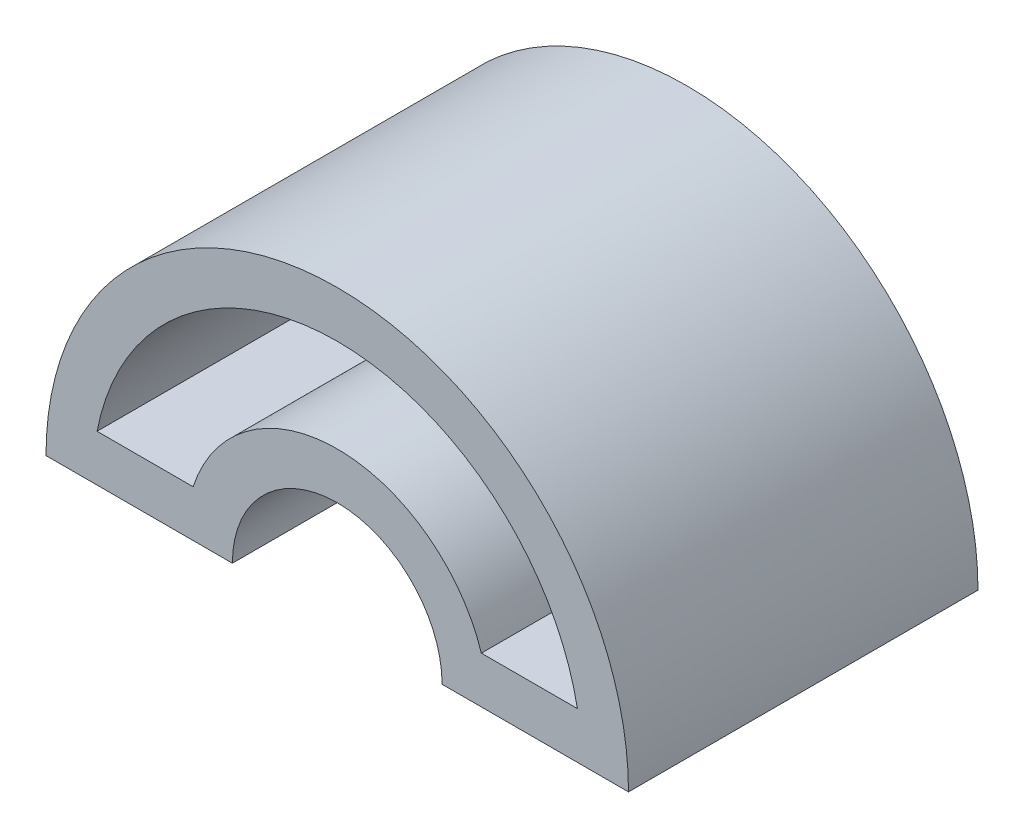
ISO-10303-21;
HEADER;
FILE_DESCRIPTION(('STEP AP214'),'2;1');
FILE_NAME('part.step','',(''),(''),'','','');
FILE_SCHEMA(('AUTOMOTIVE_DESIGN { 1 0 10303 214 1 1 1 1 }'));
ENDSEC;
DATA;
#1=APPLICATION_CONTEXT('core data for automotive mechanical design processes');
#2=APPLICATION_PROTOCOL_DEFINITION('international standard','automotive_design',2000,#1);
#3=PRODUCT_CONTEXT('',#1,'mechanical');
#4=PRODUCT('Part','Part','',(#3));
#5=PRODUCT_RELATED_PRODUCT_CATEGORY('part','',(#4));
#6=PRODUCT_DEFINITION_FORMATION('','',#4);
#7=PRODUCT_DEFINITION_CONTEXT('part definition',#1,'design');
#8=PRODUCT_DEFINITION('design','',#6,#7);
#9=PRODUCT_DEFINITION_SHAPE('','',#8);
#10=(LENGTH_UNIT() NAMED_UNIT(*) SI_UNIT(.MILLI.,.METRE.));
#11=(NAMED_UNIT(*) PLANE_ANGLE_UNIT() SI_UNIT($,.RADIAN.));
#12=(NAMED_UNIT(*) SI_UNIT($,.STERADIAN.) SOLID_ANGLE_UNIT());
#13=UNCERTAINTY_MEASURE_WITH_UNIT(LENGTH_MEASURE(1.E-05),#10,'distance_accuracy_value','');
#14=(GEOMETRIC_REPRESENTATION_CONTEXT(3) GLOBAL_UNCERTAINTY_ASSIGNED_CONTEXT((#13)) GLOBAL_UNIT_ASSIGNED_CONTEXT((#10,
#11,#12)) REPRESENTATION_CONTEXT('',''));
#15=CARTESIAN_POINT('',(0.,0.,0.));
#16=DIRECTION('',(0.,0.,1.));
#17=DIRECTION('',(1.,0.,0.));
#18=AXIS2_PLACEMENT_3D('',#15,#16,#17);
#19=CARTESIAN_POINT('',(0.,0.,60.));
#20=DIRECTION('',(0.,0.,1.));
#21=DIRECTION('',(1.,0.,0.));
#22=AXIS2_PLACEMENT_3D('',#19,#20,#21);
#23=PLANE('',#22);
#24=CARTESIAN_POINT('',(0.,0.,60.));
#25=DIRECTION('',(0.,0.,1.));
#26=DIRECTION('',(1.,0.,0.));
#27=AXIS2_PLACEMENT_3D('',#24,#25,#26);
#28=CIRCLE('',#27,50.);
#29=CARTESIAN_POINT('',(50.,0.,60.));
#30=VERTEX_POINT('',#29);
#31=CARTESIAN_POINT('',(-50.,0.,60.));
#32=VERTEX_POINT('',#31);
#33=EDGE_CURVE('E157',#30,#32,#28,.T.);
#34=ORIENTED_EDGE('',*,*,#33,.T.);
#35=DIRECTION('',(1.,0.,0.));
#36=VECTOR('',#35,1.);
#37=CARTESIAN_POINT('',(-50.,0.,60.));
#38=LINE('',#37,#36);
#39=CARTESIAN_POINT('',(-18.,0.,60.));
#40=VERTEX_POINT('',#39);
#41=EDGE_CURVE('E161',#32,#40,#38,.T.);
#42=ORIENTED_EDGE('',*,*,#41,.T.);
#43=CARTESIAN_POINT('',(0.,0.,60.));
#44=DIRECTION('',(0.,0.,-1.));
#45=DIRECTION('',(1.,0.,0.));
#46=AXIS2_PLACEMENT_3D('',#43,#44,#45);
#47=CIRCLE('',#46,18.);
#48=CARTESIAN_POINT('',(18.,0.,60.));
#49=VERTEX_POINT('',#48);
#50=EDGE_CURVE('E165',#40,#49,#47,.T.);
#51=ORIENTED_EDGE('',*,*,#50,.T.);
#52=DIRECTION('',(1.,0.,0.));
#53=VECTOR('',#52,1.);
#54=CARTESIAN_POINT('',(18.,0.,60.));
#55=LINE('',#54,#53);
#56=EDGE_CURVE('E168',#49,#30,#55,.T.);
#57=ORIENTED_EDGE('',*,*,#56,.T.);
#58=EDGE_LOOP('',(#34,#42,#51,#57));
#59=FACE_BOUND('',#58,.T.);
#60=DIRECTION('',(1.,0.,0.));
#61=VECTOR('',#60,1.);
#62=CARTESIAN_POINT('',(-41.2310562561766,8.,60.));
#63=LINE('',#62,#61);
#64=CARTESIAN_POINT('',(-41.2310562561766,8.,60.));
#65=VERTEX_POINT('',#64);
#66=CARTESIAN_POINT('',(-24.738633753706,8.,60.));
#67=VERTEX_POINT('',#66);
#68=EDGE_CURVE('E118',#65,#67,#63,.T.);
#69=ORIENTED_EDGE('',*,*,#68,.F.);
#70=CARTESIAN_POINT('',(0.,0.,60.));
#71=DIRECTION('',(0.,0.,1.));
#72=DIRECTION('',(1.,0.,0.));
#73=AXIS2_PLACEMENT_3D('',#70,#71,#72);
#74=CIRCLE('',#73,42.);
#75=CARTESIAN_POINT('',(41.2310562561766,8.,60.));
#76=VERTEX_POINT('',#75);
#77=EDGE_CURVE('E109',#76,#65,#74,.T.);
#78=ORIENTED_EDGE('',*,*,#77,.F.);
#79=DIRECTION('',(1.,0.,0.));
#80=VECTOR('',#79,1.);
#81=CARTESIAN_POINT('',(24.738633753706,8.,60.));
#82=LINE('',#81,#80);
#83=CARTESIAN_POINT('',(24.738633753706,8.,60.));
#84=VERTEX_POINT('',#83);
#85=EDGE_CURVE('E135',#84,#76,#82,.T.);
#86=ORIENTED_EDGE('',*,*,#85,.F.);
#87=CARTESIAN_POINT('',(0.,0.,60.));
#88=DIRECTION('',(0.,0.,-1.));
#89=DIRECTION('',(1.,0.,0.));
#90=AXIS2_PLACEMENT_3D('',#87,#88,#89);
#91=CIRCLE('',#90,26.);
#92=EDGE_CURVE('E131',#67,#84,#91,.T.);
#93=ORIENTED_EDGE('',*,*,#92,.F.);
#94=EDGE_LOOP('',(#69,#78,#86,#93));
#95=FACE_BOUND('',#94,.T.);
#96=ADVANCED_FACE('F43',(#59,#95),#23,.T.);
#97=CARTESIAN_POINT('',(0.,0.,0.));
#98=DIRECTION('',(0.,0.,1.));
#99=DIRECTION('',(1.,0.,0.));
#100=AXIS2_PLACEMENT_3D('',#97,#98,#99);
#101=PLANE('',#100);
#102=CARTESIAN_POINT('',(0.,0.,0.));
#103=DIRECTION('',(0.,0.,1.));
#104=DIRECTION('',(1.,0.,0.));
#105=AXIS2_PLACEMENT_3D('',#102,#103,#104);
#106=CIRCLE('',#105,50.);
#107=CARTESIAN_POINT('',(50.,0.,0.));
#108=VERTEX_POINT('',#107);
#109=CARTESIAN_POINT('',(-50.,0.,0.));
#110=VERTEX_POINT('',#109);
#111=EDGE_CURVE('E127',#108,#110,#106,.T.);
#112=ORIENTED_EDGE('',*,*,#111,.F.);
#113=DIRECTION('',(1.,0.,0.));
#114=VECTOR('',#113,1.);
#115=CARTESIAN_POINT('',(18.,0.,0.));
#116=LINE('',#115,#114);
#117=CARTESIAN_POINT('',(18.,0.,0.));
#118=VERTEX_POINT('',#117);
#119=EDGE_CURVE('E162',#118,#108,#116,.T.);
#120=ORIENTED_EDGE('',*,*,#119,.F.);
#121=CARTESIAN_POINT('',(0.,0.,0.));
#122=DIRECTION('',(0.,0.,-1.));
#123=DIRECTION('',(1.,0.,0.));
#124=AXIS2_PLACEMENT_3D('',#121,#122,#123);
#125=CIRCLE('',#124,18.);
#126=CARTESIAN_POINT('',(-18.,0.,0.));
#127=VERTEX_POINT('',#126);
#128=EDGE_CURVE('E178',#127,#118,#125,.T.);
#129=ORIENTED_EDGE('',*,*,#128,.F.);
#130=DIRECTION('',(1.,0.,0.));
#131=VECTOR('',#130,1.);
#132=CARTESIAN_POINT('',(-50.,0.,0.));
#133=LINE('',#132,#131);
#134=EDGE_CURVE('E175',#110,#127,#133,.T.);
#135=ORIENTED_EDGE('',*,*,#134,.F.);
#136=EDGE_LOOP('',(#112,#120,#129,#135));
#137=FACE_BOUND('',#136,.T.);
#138=CARTESIAN_POINT('',(0.,0.,0.));
#139=DIRECTION('',(0.,0.,1.));
#140=DIRECTION('',(1.,0.,0.));
#141=AXIS2_PLACEMENT_3D('',#138,#139,#140);
#142=CIRCLE('',#141,42.);
#143=CARTESIAN_POINT('',(41.2310562561766,8.,0.));
#144=VERTEX_POINT('',#143);
#145=CARTESIAN_POINT('',(-41.2310562561766,8.,0.));
#146=VERTEX_POINT('',#145);
#147=EDGE_CURVE('E67',#144,#146,#142,.T.);
#148=ORIENTED_EDGE('',*,*,#147,.T.);
#149=DIRECTION('',(1.,0.,0.));
#150=VECTOR('',#149,1.);
#151=CARTESIAN_POINT('',(-41.2310562561766,8.,0.));
#152=LINE('',#151,#150);
#153=CARTESIAN_POINT('',(-24.738633753706,8.,0.));
#154=VERTEX_POINT('',#153);
#155=EDGE_CURVE('E125',#146,#154,#152,.T.);
#156=ORIENTED_EDGE('',*,*,#155,.T.);
#157=CARTESIAN_POINT('',(0.,0.,0.));
#158=DIRECTION('',(0.,0.,-1.));
#159=DIRECTION('',(1.,0.,0.));
#160=AXIS2_PLACEMENT_3D('',#157,#158,#159);
#161=CIRCLE('',#160,26.);
#162=CARTESIAN_POINT('',(24.738633753706,8.,0.));
#163=VERTEX_POINT('',#162);
#164=EDGE_CURVE('E144',#154,#163,#161,.T.);
#165=ORIENTED_EDGE('',*,*,#164,.T.);
#166=DIRECTION('',(1.,0.,0.));
#167=VECTOR('',#166,1.);
#168=CARTESIAN_POINT('',(24.738633753706,8.,0.));
#169=LINE('',#168,#167);
#170=EDGE_CURVE('E119',#163,#144,#169,.T.);
#171=ORIENTED_EDGE('',*,*,#170,.T.);
#172=EDGE_LOOP('',(#148,#156,#165,#171));
#173=FACE_BOUND('',#172,.T.);
#174=ADVANCED_FACE('F201',(#137,#173),#101,.F.);
#175=CARTESIAN_POINT('',(0.,0.,60.));
#176=DIRECTION('',(0.,0.,-1.));
#177=DIRECTION('',(-1.,0.,0.));
#178=AXIS2_PLACEMENT_3D('',#175,#176,#177);
#179=CYLINDRICAL_SURFACE('',#178,50.);
#180=ORIENTED_EDGE('',*,*,#111,.T.);
#181=DIRECTION('',(0.,0.,-1.));
#182=VECTOR('',#181,1.);
#183=CARTESIAN_POINT('',(-50.,0.,60.));
#184=LINE('',#183,#182);
#185=EDGE_CURVE('E11',#32,#110,#184,.T.);
#186=ORIENTED_EDGE('',*,*,#185,.F.);
#187=ORIENTED_EDGE('',*,*,#33,.F.);
#188=DIRECTION('',(0.,0.,-1.));
#189=VECTOR('',#188,1.);
#190=CARTESIAN_POINT('',(50.,0.,60.));
#191=LINE('',#190,#189);
#192=EDGE_CURVE('E171',#30,#108,#191,.T.);
#193=ORIENTED_EDGE('',*,*,#192,.T.);
#194=EDGE_LOOP('',(#180,#186,#187,#193));
#195=FACE_BOUND('',#194,.T.);
#196=ADVANCED_FACE('F45',(#195),#179,.T.);
#197=CARTESIAN_POINT('',(-50.,0.,60.));
#198=DIRECTION('',(0.,1.,0.));
#199=DIRECTION('',(0.,0.,1.));
#200=AXIS2_PLACEMENT_3D('',#197,#198,#199);
#201=PLANE('',#200);
#202=ORIENTED_EDGE('',*,*,#134,.T.);
#203=DIRECTION('',(0.,0.,-1.));
#204=VECTOR('',#203,1.);
#205=CARTESIAN_POINT('',(-18.,0.,60.));
#206=LINE('',#205,#204);
#207=EDGE_CURVE('E52',#40,#127,#206,.T.);
#208=ORIENTED_EDGE('',*,*,#207,.F.);
#209=ORIENTED_EDGE('',*,*,#41,.F.);
#210=ORIENTED_EDGE('',*,*,#185,.T.);
#211=EDGE_LOOP('',(#202,#208,#209,#210));
#212=FACE_BOUND('',#211,.T.);
#213=ADVANCED_FACE('F211',(#212),#201,.F.);
#214=CARTESIAN_POINT('',(0.,0.,60.));
#215=DIRECTION('',(0.,0.,-1.));
#216=DIRECTION('',(-1.,0.,0.));
#217=AXIS2_PLACEMENT_3D('',#214,#215,#216);
#218=CYLINDRICAL_SURFACE('',#217,18.);
#219=ORIENTED_EDGE('',*,*,#128,.T.);
#220=DIRECTION('',(0.,0.,-1.));
#221=VECTOR('',#220,1.);
#222=CARTESIAN_POINT('',(18.,0.,60.));
#223=LINE('',#222,#221);
#224=EDGE_CURVE('E186',#49,#118,#223,.T.);
#225=ORIENTED_EDGE('',*,*,#224,.F.);
#226=ORIENTED_EDGE('',*,*,#50,.F.);
#227=ORIENTED_EDGE('',*,*,#207,.T.);
#228=EDGE_LOOP('',(#219,#225,#226,#227));
#229=FACE_BOUND('',#228,.T.);
#230=ADVANCED_FACE('F195',(#229),#218,.F.);
#231=CARTESIAN_POINT('',(18.,0.,60.));
#232=DIRECTION('',(0.,1.,0.));
#233=DIRECTION('',(0.,0.,1.));
#234=AXIS2_PLACEMENT_3D('',#231,#232,#233);
#235=PLANE('',#234);
#236=ORIENTED_EDGE('',*,*,#119,.T.);
#237=ORIENTED_EDGE('',*,*,#192,.F.);
#238=ORIENTED_EDGE('',*,*,#56,.F.);
#239=ORIENTED_EDGE('',*,*,#224,.T.);
#240=EDGE_LOOP('',(#236,#237,#238,#239));
#241=FACE_BOUND('',#240,.T.);
#242=ADVANCED_FACE('F205',(#241),#235,.F.);
#243=CARTESIAN_POINT('',(0.,0.,60.));
#244=DIRECTION('',(0.,0.,-1.));
#245=DIRECTION('',(-1.,0.,0.));
#246=AXIS2_PLACEMENT_3D('',#243,#244,#245);
#247=CYLINDRICAL_SURFACE('',#246,42.);
#248=ORIENTED_EDGE('',*,*,#147,.F.);
#249=DIRECTION('',(0.,0.,-1.));
#250=VECTOR('',#249,1.);
#251=CARTESIAN_POINT('',(41.2310562561766,8.,60.));
#252=LINE('',#251,#250);
#253=EDGE_CURVE('E113',#76,#144,#252,.T.);
#254=ORIENTED_EDGE('',*,*,#253,.F.);
#255=ORIENTED_EDGE('',*,*,#77,.T.);
#256=DIRECTION('',(0.,0.,-1.));
#257=VECTOR('',#256,1.);
#258=CARTESIAN_POINT('',(-41.2310562561766,8.,60.));
#259=LINE('',#258,#257);
#260=EDGE_CURVE('E112',#65,#146,#259,.T.);
#261=ORIENTED_EDGE('',*,*,#260,.T.);
#262=EDGE_LOOP('',(#248,#254,#255,#261));
#263=FACE_BOUND('',#262,.T.);
#264=ADVANCED_FACE('F111',(#263),#247,.F.);
#265=CARTESIAN_POINT('',(-41.2310562561766,8.,60.));
#266=DIRECTION('',(0.,1.,0.));
#267=DIRECTION('',(0.,0.,1.));
#268=AXIS2_PLACEMENT_3D('',#265,#266,#267);
#269=PLANE('',#268);
#270=ORIENTED_EDGE('',*,*,#155,.F.);
#271=ORIENTED_EDGE('',*,*,#260,.F.);
#272=ORIENTED_EDGE('',*,*,#68,.T.);
#273=DIRECTION('',(0.,0.,-1.));
#274=VECTOR('',#273,1.);
#275=CARTESIAN_POINT('',(-24.738633753706,8.,60.));
#276=LINE('',#275,#274);
#277=EDGE_CURVE('E128',#67,#154,#276,.T.);
#278=ORIENTED_EDGE('',*,*,#277,.T.);
#279=EDGE_LOOP('',(#270,#271,#272,#278));
#280=FACE_BOUND('',#279,.T.);
#281=ADVANCED_FACE('F122',(#280),#269,.T.);
#282=CARTESIAN_POINT('',(0.,0.,60.));
#283=DIRECTION('',(0.,0.,-1.));
#284=DIRECTION('',(-1.,0.,0.));
#285=AXIS2_PLACEMENT_3D('',#282,#283,#284);
#286=CYLINDRICAL_SURFACE('',#285,26.);
#287=ORIENTED_EDGE('',*,*,#164,.F.);
#288=ORIENTED_EDGE('',*,*,#277,.F.);
#289=ORIENTED_EDGE('',*,*,#92,.T.);
#290=DIRECTION('',(0.,0.,-1.));
#291=VECTOR('',#290,1.);
#292=CARTESIAN_POINT('',(24.738633753706,8.,60.));
#293=LINE('',#292,#291);
#294=EDGE_CURVE('E59',#84,#163,#293,.T.);
#295=ORIENTED_EDGE('',*,*,#294,.T.);
#296=EDGE_LOOP('',(#287,#288,#289,#295));
#297=FACE_BOUND('',#296,.T.);
#298=ADVANCED_FACE('F234',(#297),#286,.T.);
#299=CARTESIAN_POINT('',(24.738633753706,8.,60.));
#300=DIRECTION('',(0.,1.,0.));
#301=DIRECTION('',(0.,0.,1.));
#302=AXIS2_PLACEMENT_3D('',#299,#300,#301);
#303=PLANE('',#302);
#304=ORIENTED_EDGE('',*,*,#170,.F.);
#305=ORIENTED_EDGE('',*,*,#294,.F.);
#306=ORIENTED_EDGE('',*,*,#85,.T.);
#307=ORIENTED_EDGE('',*,*,#253,.T.);
#308=EDGE_LOOP('',(#304,#305,#306,#307));
#309=FACE_BOUND('',#308,.T.);
#310=ADVANCED_FACE('F238',(#309),#303,.T.);
#311=CLOSED_SHELL('',(#96,#174,#196,#213,#230,#242,#264,#281,#298,#310));
#312=MANIFOLD_SOLID_BREP('B2',#311);
#313=ADVANCED_BREP_SHAPE_REPRESENTATION('',(#18,#312),#14);
#314=SHAPE_DEFINITION_REPRESENTATION(#9,#313);
ENDSEC;
END-ISO-10303-21;
